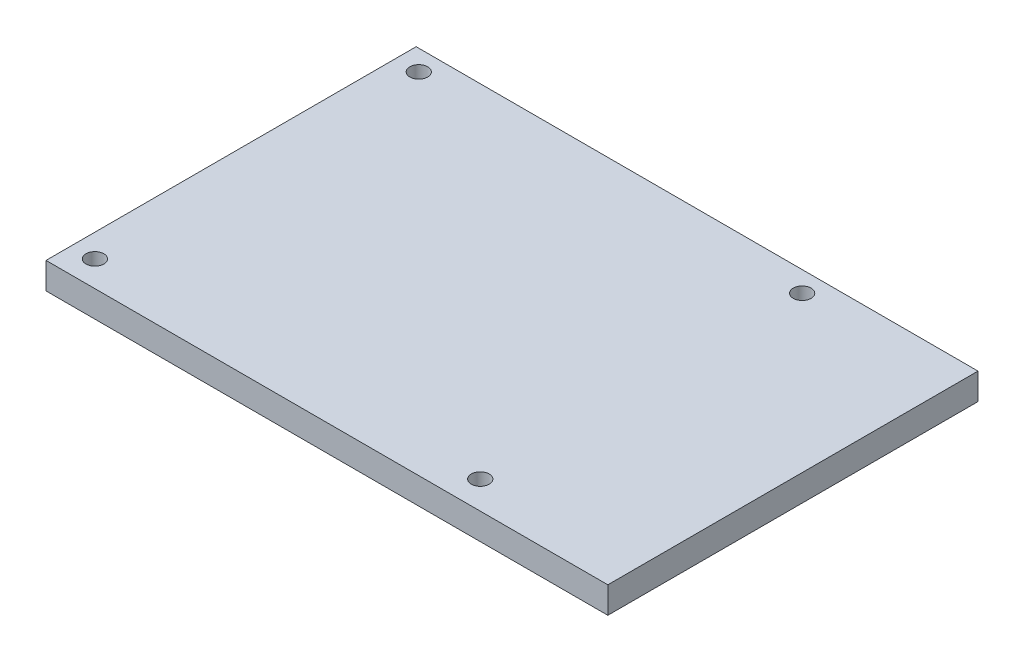
ISO-10303-21;
HEADER;
FILE_DESCRIPTION(('STEP AP214'),'2;1');
FILE_NAME('part.step','',(''),(''),'','','');
FILE_SCHEMA(('AUTOMOTIVE_DESIGN { 1 0 10303 214 1 1 1 1 }'));
ENDSEC;
DATA;
#1=APPLICATION_CONTEXT('core data for automotive mechanical design processes');
#2=APPLICATION_PROTOCOL_DEFINITION('international standard','automotive_design',2000,#1);
#3=PRODUCT_CONTEXT('',#1,'mechanical');
#4=PRODUCT('Part','Part','',(#3));
#5=PRODUCT_RELATED_PRODUCT_CATEGORY('part','',(#4));
#6=PRODUCT_DEFINITION_FORMATION('','',#4);
#7=PRODUCT_DEFINITION_CONTEXT('part definition',#1,'design');
#8=PRODUCT_DEFINITION('design','',#6,#7);
#9=PRODUCT_DEFINITION_SHAPE('','',#8);
#10=(LENGTH_UNIT() NAMED_UNIT(*) SI_UNIT(.MILLI.,.METRE.));
#11=(NAMED_UNIT(*) PLANE_ANGLE_UNIT() SI_UNIT($,.RADIAN.));
#12=(NAMED_UNIT(*) SI_UNIT($,.STERADIAN.) SOLID_ANGLE_UNIT());
#13=UNCERTAINTY_MEASURE_WITH_UNIT(LENGTH_MEASURE(1.E-05),#10,'distance_accuracy_value','');
#14=(GEOMETRIC_REPRESENTATION_CONTEXT(3) GLOBAL_UNCERTAINTY_ASSIGNED_CONTEXT((#13)) GLOBAL_UNIT_ASSIGNED_CONTEXT((#10,
#11,#12)) REPRESENTATION_CONTEXT('',''));
#15=CARTESIAN_POINT('',(0.,0.,0.));
#16=DIRECTION('',(0.,0.,1.));
#17=DIRECTION('',(1.,0.,0.));
#18=AXIS2_PLACEMENT_3D('',#15,#16,#17);
#19=CARTESIAN_POINT('',(0.,4.,0.));
#20=DIRECTION('',(0.,1.,0.));
#21=DIRECTION('',(0.,0.,1.));
#22=AXIS2_PLACEMENT_3D('',#19,#20,#21);
#23=PLANE('',#22);
#24=CARTESIAN_POINT('',(-45.7662444933993,4.,34.32957081017));
#25=DIRECTION('',(0.,1.,0.));
#26=DIRECTION('',(0.,0.,1.));
#27=AXIS2_PLACEMENT_3D('',#24,#25,#26);
#28=CIRCLE('',#27,1.35);
#29=CARTESIAN_POINT('',(-45.7662444933993,4.,35.67957081017));
#30=VERTEX_POINT('',#29);
#31=EDGE_CURVE('E142',#30,#30,#28,.T.);
#32=ORIENTED_EDGE('',*,*,#31,.F.);
#33=EDGE_LOOP('',(#32));
#34=FACE_BOUND('',#33,.T.);
#35=CARTESIAN_POINT('',(-45.7662444933993,4.,-14.67042918983));
#36=DIRECTION('',(0.,1.,0.));
#37=DIRECTION('',(0.,0.,1.));
#38=AXIS2_PLACEMENT_3D('',#35,#36,#37);
#39=CIRCLE('',#38,1.35);
#40=CARTESIAN_POINT('',(-45.7662444933993,4.,-13.32042918983));
#41=VERTEX_POINT('',#40);
#42=EDGE_CURVE('E112',#41,#41,#39,.T.);
#43=ORIENTED_EDGE('',*,*,#42,.F.);
#44=EDGE_LOOP('',(#43));
#45=FACE_BOUND('',#44,.T.);
#46=DIRECTION('',(0.,0.,1.));
#47=VECTOR('',#46,1.);
#48=CARTESIAN_POINT('',(-49.2662444933993,4.,-17.7743252937261));
#49=LINE('',#48,#47);
#50=CARTESIAN_POINT('',(-49.2662444933993,4.,-17.7743252937261));
#51=VERTEX_POINT('',#50);
#52=CARTESIAN_POINT('',(-49.2662444933993,4.,38.2256747062739));
#53=VERTEX_POINT('',#52);
#54=EDGE_CURVE('E92',#51,#53,#49,.T.);
#55=ORIENTED_EDGE('',*,*,#54,.T.);
#56=DIRECTION('',(1.,0.,0.));
#57=VECTOR('',#56,1.);
#58=CARTESIAN_POINT('',(-49.2662444933993,4.,38.2256747062739));
#59=LINE('',#58,#57);
#60=CARTESIAN_POINT('',(35.7337555066007,4.,38.2256747062739));
#61=VERTEX_POINT('',#60);
#62=EDGE_CURVE('E87',#53,#61,#59,.T.);
#63=ORIENTED_EDGE('',*,*,#62,.T.);
#64=DIRECTION('',(0.,0.,-1.));
#65=VECTOR('',#64,1.);
#66=CARTESIAN_POINT('',(35.7337555066007,4.,-17.7743252937261));
#67=LINE('',#66,#65);
#68=CARTESIAN_POINT('',(35.7337555066007,4.,-17.7743252937261));
#69=VERTEX_POINT('',#68);
#70=EDGE_CURVE('E90',#61,#69,#67,.T.);
#71=ORIENTED_EDGE('',*,*,#70,.T.);
#72=DIRECTION('',(-1.,0.,0.));
#73=VECTOR('',#72,1.);
#74=CARTESIAN_POINT('',(-49.2662444933993,4.,-17.7743252937261));
#75=LINE('',#74,#73);
#76=EDGE_CURVE('E57',#69,#51,#75,.T.);
#77=ORIENTED_EDGE('',*,*,#76,.T.);
#78=EDGE_LOOP('',(#55,#63,#71,#77));
#79=FACE_BOUND('',#78,.T.);
#80=CARTESIAN_POINT('',(12.2337555066007,4.,-14.67042918983));
#81=DIRECTION('',(0.,1.,0.));
#82=DIRECTION('',(0.,0.,1.));
#83=AXIS2_PLACEMENT_3D('',#80,#81,#82);
#84=CIRCLE('',#83,1.35);
#85=CARTESIAN_POINT('',(12.2337555066007,4.,-13.32042918983));
#86=VERTEX_POINT('',#85);
#87=EDGE_CURVE('E134',#86,#86,#84,.T.);
#88=ORIENTED_EDGE('',*,*,#87,.F.);
#89=EDGE_LOOP('',(#88));
#90=FACE_BOUND('',#89,.T.);
#91=CARTESIAN_POINT('',(12.2329593559471,4.,34.0256747062739));
#92=DIRECTION('',(0.,1.,0.));
#93=DIRECTION('',(0.,0.,1.));
#94=AXIS2_PLACEMENT_3D('',#91,#92,#93);
#95=CIRCLE('',#94,1.35);
#96=CARTESIAN_POINT('',(12.2329593559471,4.,35.3756747062739));
#97=VERTEX_POINT('',#96);
#98=EDGE_CURVE('E150',#97,#97,#95,.T.);
#99=ORIENTED_EDGE('',*,*,#98,.F.);
#100=EDGE_LOOP('',(#99));
#101=FACE_BOUND('',#100,.T.);
#102=ADVANCED_FACE('F39',(#34,#45,#79,#90,#101),#23,.T.);
#103=CARTESIAN_POINT('',(0.,0.,0.));
#104=DIRECTION('',(0.,1.,0.));
#105=DIRECTION('',(0.,0.,1.));
#106=AXIS2_PLACEMENT_3D('',#103,#104,#105);
#107=PLANE('',#106);
#108=DIRECTION('',(0.,0.,1.));
#109=VECTOR('',#108,1.);
#110=CARTESIAN_POINT('',(-49.2662444933993,0.,-17.7743252937261));
#111=LINE('',#110,#109);
#112=CARTESIAN_POINT('',(-49.2662444933993,0.,-17.7743252937261));
#113=VERTEX_POINT('',#112);
#114=CARTESIAN_POINT('',(-49.2662444933993,0.,38.2256747062739));
#115=VERTEX_POINT('',#114);
#116=EDGE_CURVE('E108',#113,#115,#111,.T.);
#117=ORIENTED_EDGE('',*,*,#116,.F.);
#118=DIRECTION('',(-1.,0.,0.));
#119=VECTOR('',#118,1.);
#120=CARTESIAN_POINT('',(-49.2662444933993,0.,-17.7743252937261));
#121=LINE('',#120,#119);
#122=CARTESIAN_POINT('',(35.7337555066007,0.,-17.7743252937261));
#123=VERTEX_POINT('',#122);
#124=EDGE_CURVE('E80',#123,#113,#121,.T.);
#125=ORIENTED_EDGE('',*,*,#124,.F.);
#126=DIRECTION('',(0.,0.,-1.));
#127=VECTOR('',#126,1.);
#128=CARTESIAN_POINT('',(35.7337555066007,0.,-17.7743252937261));
#129=LINE('',#128,#127);
#130=CARTESIAN_POINT('',(35.7337555066007,0.,38.2256747062739));
#131=VERTEX_POINT('',#130);
#132=EDGE_CURVE('E74',#131,#123,#129,.T.);
#133=ORIENTED_EDGE('',*,*,#132,.F.);
#134=DIRECTION('',(1.,0.,0.));
#135=VECTOR('',#134,1.);
#136=CARTESIAN_POINT('',(-49.2662444933993,0.,38.2256747062739));
#137=LINE('',#136,#135);
#138=EDGE_CURVE('E97',#115,#131,#137,.T.);
#139=ORIENTED_EDGE('',*,*,#138,.F.);
#140=EDGE_LOOP('',(#117,#125,#133,#139));
#141=FACE_BOUND('',#140,.T.);
#142=CARTESIAN_POINT('',(-45.7662444933993,0.,-14.67042918983));
#143=DIRECTION('',(0.,1.,0.));
#144=DIRECTION('',(0.,0.,1.));
#145=AXIS2_PLACEMENT_3D('',#142,#143,#144);
#146=CIRCLE('',#145,1.35);
#147=CARTESIAN_POINT('',(-45.7662444933993,0.,-13.32042918983));
#148=VERTEX_POINT('',#147);
#149=EDGE_CURVE('E130',#148,#148,#146,.T.);
#150=ORIENTED_EDGE('',*,*,#149,.T.);
#151=EDGE_LOOP('',(#150));
#152=FACE_BOUND('',#151,.T.);
#153=CARTESIAN_POINT('',(12.2337555066007,0.,-14.67042918983));
#154=DIRECTION('',(0.,1.,0.));
#155=DIRECTION('',(0.,0.,1.));
#156=AXIS2_PLACEMENT_3D('',#153,#154,#155);
#157=CIRCLE('',#156,1.35);
#158=CARTESIAN_POINT('',(12.2337555066007,0.,-13.32042918983));
#159=VERTEX_POINT('',#158);
#160=EDGE_CURVE('E138',#159,#159,#157,.T.);
#161=ORIENTED_EDGE('',*,*,#160,.T.);
#162=EDGE_LOOP('',(#161));
#163=FACE_BOUND('',#162,.T.);
#164=CARTESIAN_POINT('',(-45.7662444933993,0.,34.32957081017));
#165=DIRECTION('',(0.,1.,0.));
#166=DIRECTION('',(0.,0.,1.));
#167=AXIS2_PLACEMENT_3D('',#164,#165,#166);
#168=CIRCLE('',#167,1.35);
#169=CARTESIAN_POINT('',(-45.7662444933993,0.,35.67957081017));
#170=VERTEX_POINT('',#169);
#171=EDGE_CURVE('E146',#170,#170,#168,.T.);
#172=ORIENTED_EDGE('',*,*,#171,.T.);
#173=EDGE_LOOP('',(#172));
#174=FACE_BOUND('',#173,.T.);
#175=CARTESIAN_POINT('',(12.2329593559471,0.,34.0256747062739));
#176=DIRECTION('',(0.,1.,0.));
#177=DIRECTION('',(0.,0.,1.));
#178=AXIS2_PLACEMENT_3D('',#175,#176,#177);
#179=CIRCLE('',#178,1.35);
#180=CARTESIAN_POINT('',(12.2329593559471,0.,35.3756747062739));
#181=VERTEX_POINT('',#180);
#182=EDGE_CURVE('E154',#181,#181,#179,.T.);
#183=ORIENTED_EDGE('',*,*,#182,.T.);
#184=EDGE_LOOP('',(#183));
#185=FACE_BOUND('',#184,.T.);
#186=ADVANCED_FACE('F125',(#141,#152,#163,#174,#185),#107,.F.);
#187=CARTESIAN_POINT('',(-49.2662444933993,4.,-17.7743252937261));
#188=DIRECTION('',(1.,0.,0.));
#189=DIRECTION('',(0.,0.,-1.));
#190=AXIS2_PLACEMENT_3D('',#187,#188,#189);
#191=PLANE('',#190);
#192=ORIENTED_EDGE('',*,*,#116,.T.);
#193=DIRECTION('',(0.,-1.,0.));
#194=VECTOR('',#193,1.);
#195=CARTESIAN_POINT('',(-49.2662444933993,4.,38.2256747062739));
#196=LINE('',#195,#194);
#197=EDGE_CURVE('E11',#53,#115,#196,.T.);
#198=ORIENTED_EDGE('',*,*,#197,.F.);
#199=ORIENTED_EDGE('',*,*,#54,.F.);
#200=DIRECTION('',(0.,-1.,0.));
#201=VECTOR('',#200,1.);
#202=CARTESIAN_POINT('',(-49.2662444933993,4.,-17.7743252937261));
#203=LINE('',#202,#201);
#204=EDGE_CURVE('E104',#51,#113,#203,.T.);
#205=ORIENTED_EDGE('',*,*,#204,.T.);
#206=EDGE_LOOP('',(#192,#198,#199,#205));
#207=FACE_BOUND('',#206,.T.);
#208=ADVANCED_FACE('F41',(#207),#191,.F.);
#209=CARTESIAN_POINT('',(-49.2662444933993,4.,38.2256747062739));
#210=DIRECTION('',(0.,0.,-1.));
#211=DIRECTION('',(-1.,0.,0.));
#212=AXIS2_PLACEMENT_3D('',#209,#210,#211);
#213=PLANE('',#212);
#214=ORIENTED_EDGE('',*,*,#138,.T.);
#215=DIRECTION('',(0.,-1.,0.));
#216=VECTOR('',#215,1.);
#217=CARTESIAN_POINT('',(35.7337555066007,4.,38.2256747062739));
#218=LINE('',#217,#216);
#219=EDGE_CURVE('E49',#61,#131,#218,.T.);
#220=ORIENTED_EDGE('',*,*,#219,.F.);
#221=ORIENTED_EDGE('',*,*,#62,.F.);
#222=ORIENTED_EDGE('',*,*,#197,.T.);
#223=EDGE_LOOP('',(#214,#220,#221,#222));
#224=FACE_BOUND('',#223,.T.);
#225=ADVANCED_FACE('F96',(#224),#213,.F.);
#226=CARTESIAN_POINT('',(35.7337555066007,4.,-17.7743252937261));
#227=DIRECTION('',(-1.,0.,0.));
#228=DIRECTION('',(0.,0.,1.));
#229=AXIS2_PLACEMENT_3D('',#226,#227,#228);
#230=PLANE('',#229);
#231=ORIENTED_EDGE('',*,*,#132,.T.);
#232=DIRECTION('',(0.,-1.,0.));
#233=VECTOR('',#232,1.);
#234=CARTESIAN_POINT('',(35.7337555066007,4.,-17.7743252937261));
#235=LINE('',#234,#233);
#236=EDGE_CURVE('E99',#69,#123,#235,.T.);
#237=ORIENTED_EDGE('',*,*,#236,.F.);
#238=ORIENTED_EDGE('',*,*,#70,.F.);
#239=ORIENTED_EDGE('',*,*,#219,.T.);
#240=EDGE_LOOP('',(#231,#237,#238,#239));
#241=FACE_BOUND('',#240,.T.);
#242=ADVANCED_FACE('F100',(#241),#230,.F.);
#243=CARTESIAN_POINT('',(-49.2662444933993,4.,-17.7743252937261));
#244=DIRECTION('',(0.,0.,1.));
#245=DIRECTION('',(1.,0.,0.));
#246=AXIS2_PLACEMENT_3D('',#243,#244,#245);
#247=PLANE('',#246);
#248=ORIENTED_EDGE('',*,*,#124,.T.);
#249=ORIENTED_EDGE('',*,*,#204,.F.);
#250=ORIENTED_EDGE('',*,*,#76,.F.);
#251=ORIENTED_EDGE('',*,*,#236,.T.);
#252=EDGE_LOOP('',(#248,#249,#250,#251));
#253=FACE_BOUND('',#252,.T.);
#254=ADVANCED_FACE('F122',(#253),#247,.F.);
#255=CARTESIAN_POINT('',(-45.7662444933993,4.,-14.67042918983));
#256=DIRECTION('',(0.,-1.,0.));
#257=DIRECTION('',(0.,0.,-1.));
#258=AXIS2_PLACEMENT_3D('',#255,#256,#257);
#259=CYLINDRICAL_SURFACE('',#258,1.35);
#260=ORIENTED_EDGE('',*,*,#42,.T.);
#261=EDGE_LOOP('',(#260));
#262=FACE_BOUND('',#261,.T.);
#263=ORIENTED_EDGE('',*,*,#149,.F.);
#264=EDGE_LOOP('',(#263));
#265=FACE_BOUND('',#264,.T.);
#266=ADVANCED_FACE('F175',(#262,#265),#259,.F.);
#267=CARTESIAN_POINT('',(12.2337555066007,4.,-14.67042918983));
#268=DIRECTION('',(0.,-1.,0.));
#269=DIRECTION('',(0.,0.,-1.));
#270=AXIS2_PLACEMENT_3D('',#267,#268,#269);
#271=CYLINDRICAL_SURFACE('',#270,1.35);
#272=ORIENTED_EDGE('',*,*,#87,.T.);
#273=EDGE_LOOP('',(#272));
#274=FACE_BOUND('',#273,.T.);
#275=ORIENTED_EDGE('',*,*,#160,.F.);
#276=EDGE_LOOP('',(#275));
#277=FACE_BOUND('',#276,.T.);
#278=ADVANCED_FACE('F221',(#274,#277),#271,.F.);
#279=CARTESIAN_POINT('',(-45.7662444933993,4.,34.32957081017));
#280=DIRECTION('',(0.,-1.,0.));
#281=DIRECTION('',(0.,0.,-1.));
#282=AXIS2_PLACEMENT_3D('',#279,#280,#281);
#283=CYLINDRICAL_SURFACE('',#282,1.35);
#284=ORIENTED_EDGE('',*,*,#31,.T.);
#285=EDGE_LOOP('',(#284));
#286=FACE_BOUND('',#285,.T.);
#287=ORIENTED_EDGE('',*,*,#171,.F.);
#288=EDGE_LOOP('',(#287));
#289=FACE_BOUND('',#288,.T.);
#290=ADVANCED_FACE('F229',(#286,#289),#283,.F.);
#291=CARTESIAN_POINT('',(12.2329593559471,4.,34.0256747062739));
#292=DIRECTION('',(0.,-1.,0.));
#293=DIRECTION('',(0.,0.,-1.));
#294=AXIS2_PLACEMENT_3D('',#291,#292,#293);
#295=CYLINDRICAL_SURFACE('',#294,1.35);
#296=ORIENTED_EDGE('',*,*,#98,.T.);
#297=EDGE_LOOP('',(#296));
#298=FACE_BOUND('',#297,.T.);
#299=ORIENTED_EDGE('',*,*,#182,.F.);
#300=EDGE_LOOP('',(#299));
#301=FACE_BOUND('',#300,.T.);
#302=ADVANCED_FACE('F162',(#298,#301),#295,.F.);
#303=CLOSED_SHELL('',(#102,#186,#208,#225,#242,#254,#266,#278,#290,#302));
#304=MANIFOLD_SOLID_BREP('B2',#303);
#305=ADVANCED_BREP_SHAPE_REPRESENTATION('',(#18,#304),#14);
#306=SHAPE_DEFINITION_REPRESENTATION(#9,#305);
ENDSEC;
END-ISO-10303-21;
